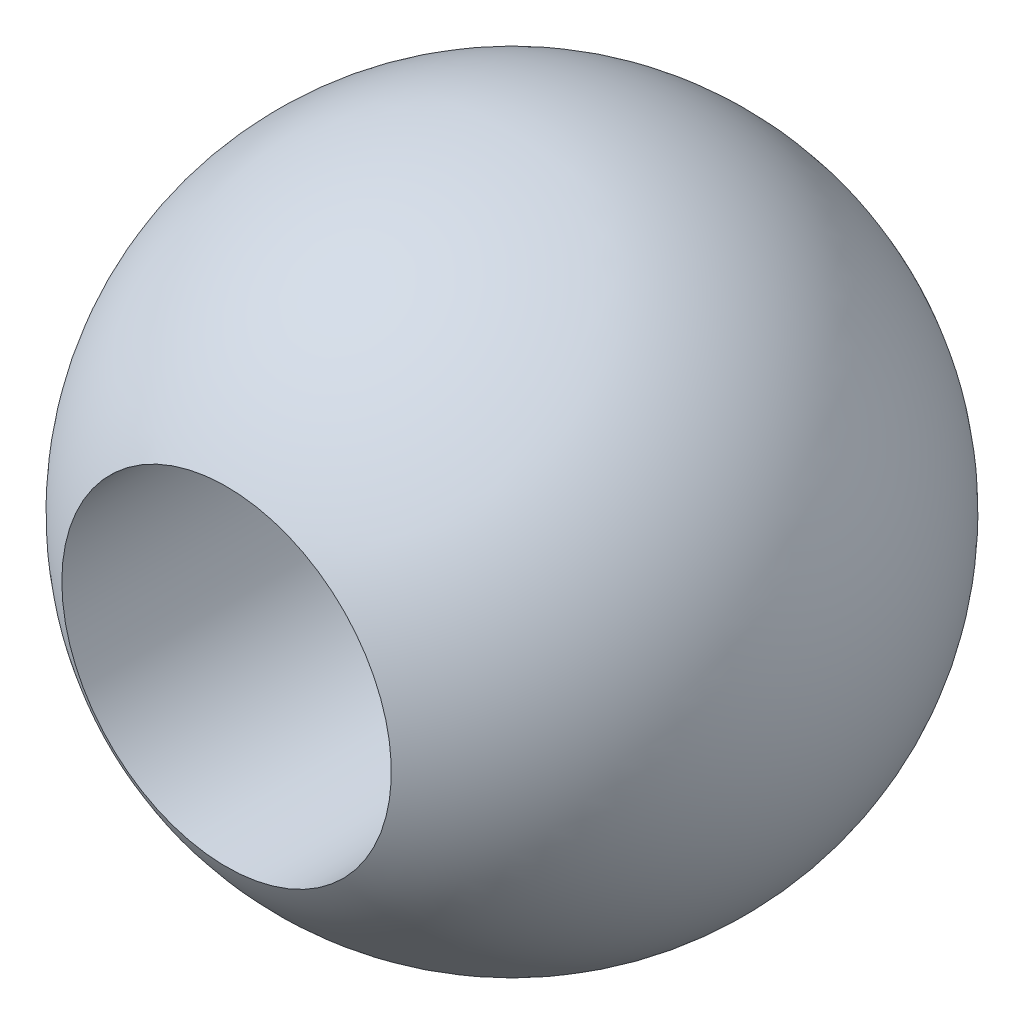
ISO-10303-21;
HEADER;
FILE_DESCRIPTION(('STEP AP214'),'2;1');
FILE_NAME('part.step','',(''),(''),'','','');
FILE_SCHEMA(('AUTOMOTIVE_DESIGN { 1 0 10303 214 1 1 1 1 }'));
ENDSEC;
DATA;
#1=APPLICATION_CONTEXT('core data for automotive mechanical design processes');
#2=APPLICATION_PROTOCOL_DEFINITION('international standard','automotive_design',2000,#1);
#3=PRODUCT_CONTEXT('',#1,'mechanical');
#4=PRODUCT('Part','Part','',(#3));
#5=PRODUCT_RELATED_PRODUCT_CATEGORY('part','',(#4));
#6=PRODUCT_DEFINITION_FORMATION('','',#4);
#7=PRODUCT_DEFINITION_CONTEXT('part definition',#1,'design');
#8=PRODUCT_DEFINITION('design','',#6,#7);
#9=PRODUCT_DEFINITION_SHAPE('','',#8);
#10=(LENGTH_UNIT() NAMED_UNIT(*) SI_UNIT(.MILLI.,.METRE.));
#11=(NAMED_UNIT(*) PLANE_ANGLE_UNIT() SI_UNIT($,.RADIAN.));
#12=(NAMED_UNIT(*) SI_UNIT($,.STERADIAN.) SOLID_ANGLE_UNIT());
#13=UNCERTAINTY_MEASURE_WITH_UNIT(LENGTH_MEASURE(1.E-05),#10,'distance_accuracy_value','');
#14=(GEOMETRIC_REPRESENTATION_CONTEXT(3) GLOBAL_UNCERTAINTY_ASSIGNED_CONTEXT((#13)) GLOBAL_UNIT_ASSIGNED_CONTEXT((#10,
#11,#12)) REPRESENTATION_CONTEXT('',''));
#15=CARTESIAN_POINT('',(0.,0.,0.));
#16=DIRECTION('',(0.,0.,1.));
#17=DIRECTION('',(1.,0.,0.));
#18=AXIS2_PLACEMENT_3D('',#15,#16,#17);
#19=CARTESIAN_POINT('',(0.,0.,0.));
#20=DIRECTION('',(0.,1.,0.));
#21=DIRECTION('',(1.,0.,0.));
#22=AXIS2_PLACEMENT_3D('',#19,#20,#21);
#23=SPHERICAL_SURFACE('',#22,4.);
#24=CARTESIAN_POINT('',(0.,0.,0.));
#25=DIRECTION('',(0.,0.,-1.));
#26=DIRECTION('',(-1.,0.,0.));
#27=AXIS2_PLACEMENT_3D('',#24,#25,#26);
#28=SPHERICAL_SURFACE('',#27,4.);
#29=CARTESIAN_POINT('',(0.,0.,3.46410161513775));
#30=DIRECTION('',(0.,0.,-1.));
#31=DIRECTION('',(-1.,0.,0.));
#32=AXIS2_PLACEMENT_3D('',#29,#30,#31);
#33=CIRCLE('',#32,2.);
#34=CARTESIAN_POINT('',(-2.,0.,3.46410161513775));
#35=VERTEX_POINT('',#34);
#36=EDGE_CURVE('E10',#35,#35,#33,.T.);
#37=ORIENTED_EDGE('',*,*,#36,.T.);
#38=EDGE_LOOP('',(#37));
#39=FACE_BOUND('',#38,.T.);
#40=CARTESIAN_POINT('',(0.,0.,-3.46410161513775));
#41=DIRECTION('',(0.,0.,1.));
#42=DIRECTION('',(1.,0.,0.));
#43=AXIS2_PLACEMENT_3D('',#40,#41,#42);
#44=CIRCLE('',#43,2.);
#45=CARTESIAN_POINT('',(2.,0.,-3.46410161513775));
#46=VERTEX_POINT('',#45);
#47=EDGE_CURVE('E45',#46,#46,#44,.T.);
#48=ORIENTED_EDGE('',*,*,#47,.T.);
#49=EDGE_LOOP('',(#48));
#50=FACE_BOUND('',#49,.T.);
#51=ADVANCED_FACE('F39',(#39,#50),#28,.T.);
#52=CARTESIAN_POINT('',(0.,0.,-4.));
#53=DIRECTION('',(0.,0.,1.));
#54=DIRECTION('',(1.,0.,0.));
#55=AXIS2_PLACEMENT_3D('',#52,#53,#54);
#56=CYLINDRICAL_SURFACE('',#55,2.);
#57=ORIENTED_EDGE('',*,*,#47,.F.);
#58=EDGE_LOOP('',(#57));
#59=FACE_BOUND('',#58,.T.);
#60=ORIENTED_EDGE('',*,*,#36,.F.);
#61=EDGE_LOOP('',(#60));
#62=FACE_BOUND('',#61,.T.);
#63=ADVANCED_FACE('F52',(#59,#62),#56,.F.);
#64=CLOSED_SHELL('',(#51,#63));
#65=MANIFOLD_SOLID_BREP('B2',#64);
#66=ADVANCED_BREP_SHAPE_REPRESENTATION('',(#18,#65),#14);
#67=SHAPE_DEFINITION_REPRESENTATION(#9,#66);
ENDSEC;
END-ISO-10303-21;
